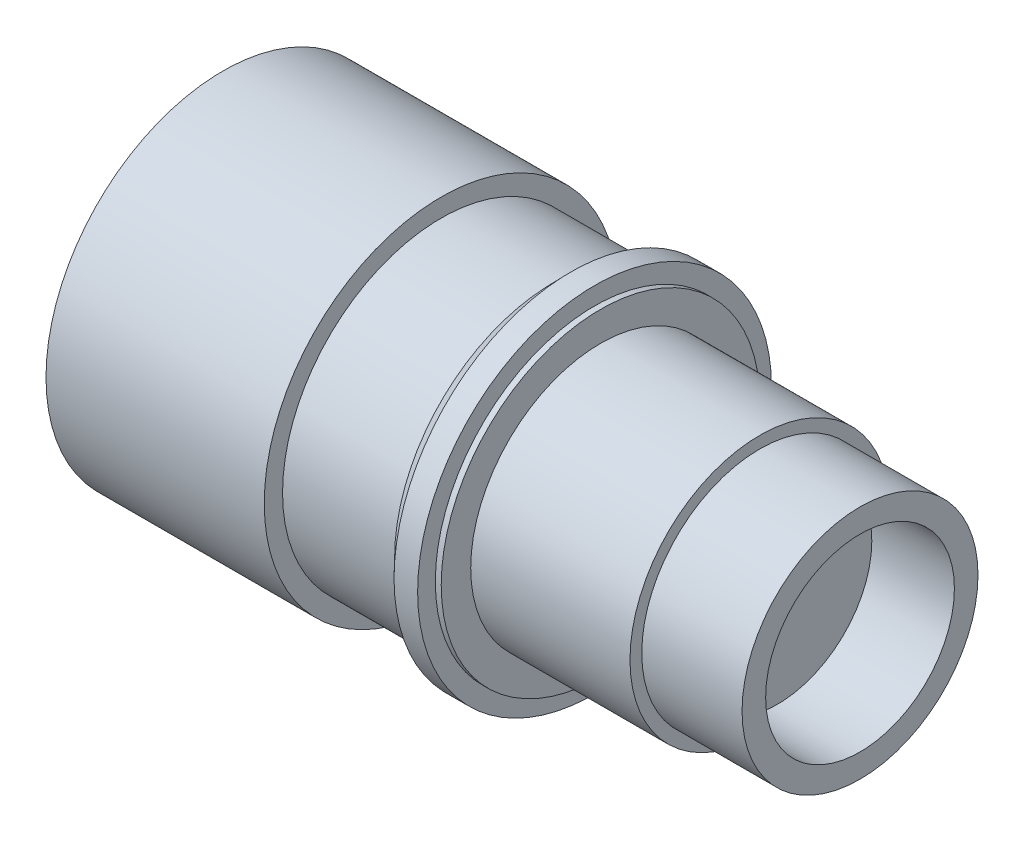
ISO-10303-21;
HEADER;
FILE_DESCRIPTION(('STEP AP214'),'2;1');
FILE_NAME('part.step','',(''),(''),'','','');
FILE_SCHEMA(('AUTOMOTIVE_DESIGN { 1 0 10303 214 1 1 1 1 }'));
ENDSEC;
DATA;
#1=APPLICATION_CONTEXT('core data for automotive mechanical design processes');
#2=APPLICATION_PROTOCOL_DEFINITION('international standard','automotive_design',2000,#1);
#3=PRODUCT_CONTEXT('',#1,'mechanical');
#4=PRODUCT('Part','Part','',(#3));
#5=PRODUCT_RELATED_PRODUCT_CATEGORY('part','',(#4));
#6=PRODUCT_DEFINITION_FORMATION('','',#4);
#7=PRODUCT_DEFINITION_CONTEXT('part definition',#1,'design');
#8=PRODUCT_DEFINITION('design','',#6,#7);
#9=PRODUCT_DEFINITION_SHAPE('','',#8);
#10=(LENGTH_UNIT() NAMED_UNIT(*) SI_UNIT(.MILLI.,.METRE.));
#11=(NAMED_UNIT(*) PLANE_ANGLE_UNIT() SI_UNIT($,.RADIAN.));
#12=(NAMED_UNIT(*) SI_UNIT($,.STERADIAN.) SOLID_ANGLE_UNIT());
#13=UNCERTAINTY_MEASURE_WITH_UNIT(LENGTH_MEASURE(1.E-05),#10,'distance_accuracy_value','');
#14=(GEOMETRIC_REPRESENTATION_CONTEXT(3) GLOBAL_UNCERTAINTY_ASSIGNED_CONTEXT((#13)) GLOBAL_UNIT_ASSIGNED_CONTEXT((#10,
#11,#12)) REPRESENTATION_CONTEXT('',''));
#15=CARTESIAN_POINT('',(0.,0.,0.));
#16=DIRECTION('',(0.,0.,1.));
#17=DIRECTION('',(1.,0.,0.));
#18=AXIS2_PLACEMENT_3D('',#15,#16,#17);
#19=CARTESIAN_POINT('',(-84.7960698689956,0.,0.));
#20=DIRECTION('',(-1.,0.,0.));
#21=DIRECTION('',(0.,0.,1.));
#22=AXIS2_PLACEMENT_3D('',#19,#20,#21);
#23=CYLINDRICAL_SURFACE('',#22,13.45);
#24=CARTESIAN_POINT('',(-4.,0.,0.));
#25=DIRECTION('',(-1.,0.,0.));
#26=DIRECTION('',(0.,0.,1.));
#27=AXIS2_PLACEMENT_3D('',#24,#25,#26);
#28=CIRCLE('',#27,13.45);
#29=CARTESIAN_POINT('',(-4.,0.,13.45));
#30=VERTEX_POINT('',#29);
#31=EDGE_CURVE('E55',#30,#30,#28,.T.);
#32=ORIENTED_EDGE('',*,*,#31,.T.);
#33=EDGE_LOOP('',(#32));
#34=FACE_BOUND('',#33,.T.);
#35=CARTESIAN_POINT('',(-13.5,0.,0.));
#36=DIRECTION('',(-1.,0.,0.));
#37=DIRECTION('',(0.,0.,1.));
#38=AXIS2_PLACEMENT_3D('',#35,#36,#37);
#39=CIRCLE('',#38,13.45);
#40=CARTESIAN_POINT('',(-13.5,0.,13.45));
#41=VERTEX_POINT('',#40);
#42=EDGE_CURVE('E10',#41,#41,#39,.T.);
#43=ORIENTED_EDGE('',*,*,#42,.F.);
#44=EDGE_LOOP('',(#43));
#45=FACE_BOUND('',#44,.T.);
#46=ADVANCED_FACE('F15',(#34,#45),#23,.T.);
#47=CARTESIAN_POINT('',(15.,8.,0.));
#48=DIRECTION('',(-1.,0.,0.));
#49=DIRECTION('',(0.,0.,1.));
#50=AXIS2_PLACEMENT_3D('',#47,#48,#49);
#51=PLANE('',#50);
#52=CARTESIAN_POINT('',(15.,0.,0.));
#53=DIRECTION('',(-1.,0.,0.));
#54=DIRECTION('',(0.,0.,1.));
#55=AXIS2_PLACEMENT_3D('',#52,#53,#54);
#56=CIRCLE('',#55,8.);
#57=CARTESIAN_POINT('',(15.,0.,8.));
#58=VERTEX_POINT('',#57);
#59=EDGE_CURVE('E21',#58,#58,#56,.T.);
#60=ORIENTED_EDGE('',*,*,#59,.F.);
#61=EDGE_LOOP('',(#60));
#62=FACE_BOUND('',#61,.T.);
#63=ADVANCED_FACE('F83',(#62),#51,.F.);
#64=CARTESIAN_POINT('',(-84.7960698689956,0.,0.));
#65=DIRECTION('',(-1.,0.,0.));
#66=DIRECTION('',(0.,0.,1.));
#67=AXIS2_PLACEMENT_3D('',#64,#65,#66);
#68=CYLINDRICAL_SURFACE('',#67,8.);
#69=CARTESIAN_POINT('',(22.,0.,0.));
#70=DIRECTION('',(-1.,0.,0.));
#71=DIRECTION('',(0.,0.,1.));
#72=AXIS2_PLACEMENT_3D('',#69,#70,#71);
#73=CIRCLE('',#72,8.);
#74=CARTESIAN_POINT('',(22.,0.,8.));
#75=VERTEX_POINT('',#74);
#76=EDGE_CURVE('E25',#75,#75,#73,.T.);
#77=ORIENTED_EDGE('',*,*,#76,.F.);
#78=EDGE_LOOP('',(#77));
#79=FACE_BOUND('',#78,.T.);
#80=ORIENTED_EDGE('',*,*,#59,.T.);
#81=EDGE_LOOP('',(#80));
#82=FACE_BOUND('',#81,.T.);
#83=ADVANCED_FACE('F88',(#79,#82),#68,.F.);
#84=CARTESIAN_POINT('',(22.,10.,0.));
#85=DIRECTION('',(-1.,0.,0.));
#86=DIRECTION('',(0.,0.,1.));
#87=AXIS2_PLACEMENT_3D('',#84,#85,#86);
#88=PLANE('',#87);
#89=CARTESIAN_POINT('',(22.,0.,0.));
#90=DIRECTION('',(-1.,0.,0.));
#91=DIRECTION('',(0.,0.,1.));
#92=AXIS2_PLACEMENT_3D('',#89,#90,#91);
#93=CIRCLE('',#92,10.);
#94=CARTESIAN_POINT('',(22.,0.,10.));
#95=VERTEX_POINT('',#94);
#96=EDGE_CURVE('E29',#95,#95,#93,.T.);
#97=ORIENTED_EDGE('',*,*,#96,.F.);
#98=EDGE_LOOP('',(#97));
#99=FACE_BOUND('',#98,.T.);
#100=ORIENTED_EDGE('',*,*,#76,.T.);
#101=EDGE_LOOP('',(#100));
#102=FACE_BOUND('',#101,.T.);
#103=ADVANCED_FACE('F133',(#99,#102),#88,.F.);
#104=CARTESIAN_POINT('',(-84.7960698689956,0.,0.));
#105=DIRECTION('',(-1.,0.,0.));
#106=DIRECTION('',(0.,0.,1.));
#107=AXIS2_PLACEMENT_3D('',#104,#105,#106);
#108=CYLINDRICAL_SURFACE('',#107,10.);
#109=CARTESIAN_POINT('',(13.5,0.,0.));
#110=DIRECTION('',(-1.,0.,0.));
#111=DIRECTION('',(0.,0.,1.));
#112=AXIS2_PLACEMENT_3D('',#109,#110,#111);
#113=CIRCLE('',#112,10.);
#114=CARTESIAN_POINT('',(13.5,0.,10.));
#115=VERTEX_POINT('',#114);
#116=EDGE_CURVE('E34',#115,#115,#113,.T.);
#117=ORIENTED_EDGE('',*,*,#116,.F.);
#118=EDGE_LOOP('',(#117));
#119=FACE_BOUND('',#118,.T.);
#120=ORIENTED_EDGE('',*,*,#96,.T.);
#121=EDGE_LOOP('',(#120));
#122=FACE_BOUND('',#121,.T.);
#123=ADVANCED_FACE('F127',(#119,#122),#108,.T.);
#124=CARTESIAN_POINT('',(13.5,11.,0.));
#125=DIRECTION('',(-1.,0.,0.));
#126=DIRECTION('',(0.,0.,1.));
#127=AXIS2_PLACEMENT_3D('',#124,#125,#126);
#128=PLANE('',#127);
#129=CARTESIAN_POINT('',(13.5,0.,0.));
#130=DIRECTION('',(-1.,0.,0.));
#131=DIRECTION('',(0.,0.,1.));
#132=AXIS2_PLACEMENT_3D('',#129,#130,#131);
#133=CIRCLE('',#132,11.);
#134=CARTESIAN_POINT('',(13.5,0.,11.));
#135=VERTEX_POINT('',#134);
#136=EDGE_CURVE('E37',#135,#135,#133,.T.);
#137=ORIENTED_EDGE('',*,*,#136,.F.);
#138=EDGE_LOOP('',(#137));
#139=FACE_BOUND('',#138,.T.);
#140=ORIENTED_EDGE('',*,*,#116,.T.);
#141=EDGE_LOOP('',(#140));
#142=FACE_BOUND('',#141,.T.);
#143=ADVANCED_FACE('F121',(#139,#142),#128,.F.);
#144=CARTESIAN_POINT('',(-84.7960698689956,0.,0.));
#145=DIRECTION('',(-1.,0.,0.));
#146=DIRECTION('',(0.,0.,1.));
#147=AXIS2_PLACEMENT_3D('',#144,#145,#146);
#148=CYLINDRICAL_SURFACE('',#147,11.);
#149=CARTESIAN_POINT('',(0.,0.,0.));
#150=DIRECTION('',(-1.,0.,0.));
#151=DIRECTION('',(0.,0.,1.));
#152=AXIS2_PLACEMENT_3D('',#149,#150,#151);
#153=CIRCLE('',#152,11.);
#154=CARTESIAN_POINT('',(0.,0.,11.));
#155=VERTEX_POINT('',#154);
#156=EDGE_CURVE('E40',#155,#155,#153,.T.);
#157=ORIENTED_EDGE('',*,*,#156,.F.);
#158=EDGE_LOOP('',(#157));
#159=FACE_BOUND('',#158,.T.);
#160=ORIENTED_EDGE('',*,*,#136,.T.);
#161=EDGE_LOOP('',(#160));
#162=FACE_BOUND('',#161,.T.);
#163=ADVANCED_FACE('F115',(#159,#162),#148,.T.);
#164=CARTESIAN_POINT('',(0.,13.5,0.));
#165=DIRECTION('',(-1.,0.,0.));
#166=DIRECTION('',(0.,0.,1.));
#167=AXIS2_PLACEMENT_3D('',#164,#165,#166);
#168=PLANE('',#167);
#169=CARTESIAN_POINT('',(0.,0.,0.));
#170=DIRECTION('',(-1.,0.,0.));
#171=DIRECTION('',(0.,0.,1.));
#172=AXIS2_PLACEMENT_3D('',#169,#170,#171);
#173=CIRCLE('',#172,13.5);
#174=CARTESIAN_POINT('',(0.,0.,13.5));
#175=VERTEX_POINT('',#174);
#176=EDGE_CURVE('E43',#175,#175,#173,.T.);
#177=ORIENTED_EDGE('',*,*,#176,.F.);
#178=EDGE_LOOP('',(#177));
#179=FACE_BOUND('',#178,.T.);
#180=ORIENTED_EDGE('',*,*,#156,.T.);
#181=EDGE_LOOP('',(#180));
#182=FACE_BOUND('',#181,.T.);
#183=ADVANCED_FACE('F109',(#179,#182),#168,.F.);
#184=CARTESIAN_POINT('',(-84.7960698689956,0.,0.));
#185=DIRECTION('',(-1.,0.,0.));
#186=DIRECTION('',(0.,0.,1.));
#187=AXIS2_PLACEMENT_3D('',#184,#185,#186);
#188=CYLINDRICAL_SURFACE('',#187,13.5);
#189=CARTESIAN_POINT('',(-0.5,0.,0.));
#190=DIRECTION('',(-1.,0.,0.));
#191=DIRECTION('',(0.,0.,1.));
#192=AXIS2_PLACEMENT_3D('',#189,#190,#191);
#193=CIRCLE('',#192,13.5);
#194=CARTESIAN_POINT('',(-0.5,0.,13.5));
#195=VERTEX_POINT('',#194);
#196=EDGE_CURVE('E46',#195,#195,#193,.T.);
#197=ORIENTED_EDGE('',*,*,#196,.F.);
#198=EDGE_LOOP('',(#197));
#199=FACE_BOUND('',#198,.T.);
#200=ORIENTED_EDGE('',*,*,#176,.T.);
#201=EDGE_LOOP('',(#200));
#202=FACE_BOUND('',#201,.T.);
#203=ADVANCED_FACE('F103',(#199,#202),#188,.T.);
#204=CARTESIAN_POINT('',(-0.5,15.,0.));
#205=DIRECTION('',(-1.,0.,0.));
#206=DIRECTION('',(0.,0.,1.));
#207=AXIS2_PLACEMENT_3D('',#204,#205,#206);
#208=PLANE('',#207);
#209=CARTESIAN_POINT('',(-0.5,0.,0.));
#210=DIRECTION('',(-1.,0.,0.));
#211=DIRECTION('',(0.,0.,1.));
#212=AXIS2_PLACEMENT_3D('',#209,#210,#211);
#213=CIRCLE('',#212,15.);
#214=CARTESIAN_POINT('',(-0.5,0.,15.));
#215=VERTEX_POINT('',#214);
#216=EDGE_CURVE('E49',#215,#215,#213,.T.);
#217=ORIENTED_EDGE('',*,*,#216,.F.);
#218=EDGE_LOOP('',(#217));
#219=FACE_BOUND('',#218,.T.);
#220=ORIENTED_EDGE('',*,*,#196,.T.);
#221=EDGE_LOOP('',(#220));
#222=FACE_BOUND('',#221,.T.);
#223=ADVANCED_FACE('F97',(#219,#222),#208,.F.);
#224=CARTESIAN_POINT('',(-84.7960698689956,0.,0.));
#225=DIRECTION('',(-1.,0.,0.));
#226=DIRECTION('',(0.,0.,1.));
#227=AXIS2_PLACEMENT_3D('',#224,#225,#226);
#228=CYLINDRICAL_SURFACE('',#227,15.);
#229=CARTESIAN_POINT('',(-2.5,0.,0.));
#230=DIRECTION('',(-1.,0.,0.));
#231=DIRECTION('',(0.,0.,1.));
#232=AXIS2_PLACEMENT_3D('',#229,#230,#231);
#233=CIRCLE('',#232,15.);
#234=CARTESIAN_POINT('',(-2.5,0.,15.));
#235=VERTEX_POINT('',#234);
#236=EDGE_CURVE('E52',#235,#235,#233,.T.);
#237=ORIENTED_EDGE('',*,*,#236,.F.);
#238=EDGE_LOOP('',(#237));
#239=FACE_BOUND('',#238,.T.);
#240=ORIENTED_EDGE('',*,*,#216,.T.);
#241=EDGE_LOOP('',(#240));
#242=FACE_BOUND('',#241,.T.);
#243=ADVANCED_FACE('F79',(#239,#242),#228,.T.);
#244=CARTESIAN_POINT('',(-2.5,0.,0.));
#245=DIRECTION('',(1.,0.,0.));
#246=DIRECTION('',(0.,0.,-1.));
#247=AXIS2_PLACEMENT_3D('',#244,#245,#246);
#248=CONICAL_SURFACE('',#247,15.,0.801790137705452);
#249=ORIENTED_EDGE('',*,*,#31,.F.);
#250=EDGE_LOOP('',(#249));
#251=FACE_BOUND('',#250,.T.);
#252=ORIENTED_EDGE('',*,*,#236,.T.);
#253=EDGE_LOOP('',(#252));
#254=FACE_BOUND('',#253,.T.);
#255=ADVANCED_FACE('F69',(#251,#254),#248,.T.);
#256=CARTESIAN_POINT('',(-13.5,0.,0.));
#257=DIRECTION('',(-1.,0.,0.));
#258=DIRECTION('',(0.,0.,1.));
#259=AXIS2_PLACEMENT_3D('',#256,#257,#258);
#260=PLANE('',#259);
#261=CARTESIAN_POINT('',(-13.5,0.,0.));
#262=DIRECTION('',(-1.,0.,0.));
#263=DIRECTION('',(0.,0.,1.));
#264=AXIS2_PLACEMENT_3D('',#261,#262,#263);
#265=CIRCLE('',#264,15.);
#266=CARTESIAN_POINT('',(-13.5,0.,15.));
#267=VERTEX_POINT('',#266);
#268=EDGE_CURVE('E61',#267,#267,#265,.T.);
#269=ORIENTED_EDGE('',*,*,#268,.F.);
#270=EDGE_LOOP('',(#269));
#271=FACE_BOUND('',#270,.T.);
#272=ORIENTED_EDGE('',*,*,#42,.T.);
#273=EDGE_LOOP('',(#272));
#274=FACE_BOUND('',#273,.T.);
#275=ADVANCED_FACE('F67',(#271,#274),#260,.F.);
#276=CARTESIAN_POINT('',(-168.426406871193,0.,0.));
#277=DIRECTION('',(1.,0.,0.));
#278=DIRECTION('',(0.,0.,-1.));
#279=AXIS2_PLACEMENT_3D('',#276,#277,#278);
#280=CYLINDRICAL_SURFACE('',#279,15.);
#281=CARTESIAN_POINT('',(-32.,0.,0.));
#282=DIRECTION('',(-1.,0.,0.));
#283=DIRECTION('',(0.,0.,1.));
#284=AXIS2_PLACEMENT_3D('',#281,#282,#283);
#285=CIRCLE('',#284,15.);
#286=CARTESIAN_POINT('',(-32.,0.,15.));
#287=VERTEX_POINT('',#286);
#288=EDGE_CURVE('E58',#287,#287,#285,.T.);
#289=ORIENTED_EDGE('',*,*,#288,.F.);
#290=EDGE_LOOP('',(#289));
#291=FACE_BOUND('',#290,.T.);
#292=ORIENTED_EDGE('',*,*,#268,.T.);
#293=EDGE_LOOP('',(#292));
#294=FACE_BOUND('',#293,.T.);
#295=ADVANCED_FACE('F65',(#291,#294),#280,.T.);
#296=CARTESIAN_POINT('',(-32.,10.,0.));
#297=DIRECTION('',(-1.,0.,0.));
#298=DIRECTION('',(0.,0.,1.));
#299=AXIS2_PLACEMENT_3D('',#296,#297,#298);
#300=PLANE('',#299);
#301=ORIENTED_EDGE('',*,*,#288,.T.);
#302=EDGE_LOOP('',(#301));
#303=FACE_BOUND('',#302,.T.);
#304=ADVANCED_FACE('F76',(#303),#300,.T.);
#305=CLOSED_SHELL('',(#46,#63,#83,#103,#123,#143,#163,#183,#203,#223,#243,#255,#275,#295,#304));
#306=MANIFOLD_SOLID_BREP('B1',#305);
#307=ADVANCED_BREP_SHAPE_REPRESENTATION('',(#18,#306),#14);
#308=SHAPE_DEFINITION_REPRESENTATION(#9,#307);
ENDSEC;
END-ISO-10303-21;
